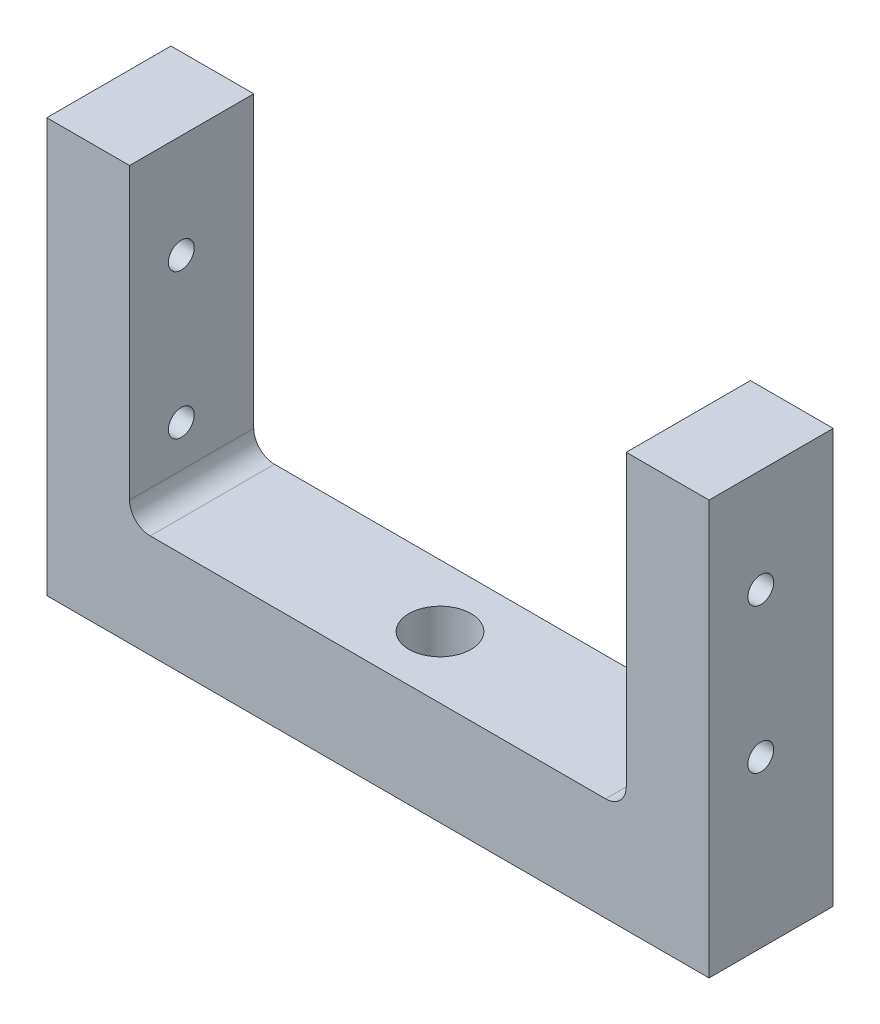
ISO-10303-21;
HEADER;
FILE_DESCRIPTION(('STEP AP214'),'2;1');
FILE_NAME('part.step','',(''),(''),'','','');
FILE_SCHEMA(('AUTOMOTIVE_DESIGN { 1 0 10303 214 1 1 1 1 }'));
ENDSEC;
DATA;
#1=APPLICATION_CONTEXT('core data for automotive mechanical design processes');
#2=APPLICATION_PROTOCOL_DEFINITION('international standard','automotive_design',2000,#1);
#3=PRODUCT_CONTEXT('',#1,'mechanical');
#4=PRODUCT('Part','Part','',(#3));
#5=PRODUCT_RELATED_PRODUCT_CATEGORY('part','',(#4));
#6=PRODUCT_DEFINITION_FORMATION('','',#4);
#7=PRODUCT_DEFINITION_CONTEXT('part definition',#1,'design');
#8=PRODUCT_DEFINITION('design','',#6,#7);
#9=PRODUCT_DEFINITION_SHAPE('','',#8);
#10=(LENGTH_UNIT() NAMED_UNIT(*) SI_UNIT(.MILLI.,.METRE.));
#11=(NAMED_UNIT(*) PLANE_ANGLE_UNIT() SI_UNIT($,.RADIAN.));
#12=(NAMED_UNIT(*) SI_UNIT($,.STERADIAN.) SOLID_ANGLE_UNIT());
#13=UNCERTAINTY_MEASURE_WITH_UNIT(LENGTH_MEASURE(1.E-05),#10,'distance_accuracy_value','');
#14=(GEOMETRIC_REPRESENTATION_CONTEXT(3) GLOBAL_UNCERTAINTY_ASSIGNED_CONTEXT((#13)) GLOBAL_UNIT_ASSIGNED_CONTEXT((#10,
#11,#12)) REPRESENTATION_CONTEXT('',''));
#15=CARTESIAN_POINT('',(0.,0.,0.));
#16=DIRECTION('',(0.,0.,1.));
#17=DIRECTION('',(1.,0.,0.));
#18=AXIS2_PLACEMENT_3D('',#15,#16,#17);
#19=CARTESIAN_POINT('',(0.,10.,6.));
#20=DIRECTION('',(0.,1.,0.));
#21=DIRECTION('',(0.,0.,1.));
#22=AXIS2_PLACEMENT_3D('',#19,#20,#21);
#23=PLANE('',#22);
#24=DIRECTION('',(1.,0.,0.));
#25=VECTOR('',#24,1.);
#26=CARTESIAN_POINT('',(0.,10.,0.));
#27=LINE('',#26,#25);
#28=CARTESIAN_POINT('',(12.,10.,0.));
#29=VERTEX_POINT('',#28);
#30=CARTESIAN_POINT('',(16.,10.,0.));
#31=VERTEX_POINT('',#30);
#32=EDGE_CURVE('E125',#29,#31,#27,.T.);
#33=ORIENTED_EDGE('',*,*,#32,.F.);
#34=DIRECTION('',(0.,0.,-1.));
#35=VECTOR('',#34,1.);
#36=CARTESIAN_POINT('',(12.,10.,6.));
#37=LINE('',#36,#35);
#38=CARTESIAN_POINT('',(12.,10.,6.));
#39=VERTEX_POINT('',#38);
#40=EDGE_CURVE('E120',#39,#29,#37,.T.);
#41=ORIENTED_EDGE('',*,*,#40,.F.);
#42=DIRECTION('',(1.,0.,0.));
#43=VECTOR('',#42,1.);
#44=CARTESIAN_POINT('',(0.,10.,6.));
#45=LINE('',#44,#43);
#46=CARTESIAN_POINT('',(16.,10.,6.));
#47=VERTEX_POINT('',#46);
#48=EDGE_CURVE('E122',#39,#47,#45,.T.);
#49=ORIENTED_EDGE('',*,*,#48,.T.);
#50=DIRECTION('',(0.,0.,-1.));
#51=VECTOR('',#50,1.);
#52=CARTESIAN_POINT('',(16.,10.,6.));
#53=LINE('',#52,#51);
#54=EDGE_CURVE('E173',#47,#31,#53,.T.);
#55=ORIENTED_EDGE('',*,*,#54,.T.);
#56=EDGE_LOOP('',(#33,#41,#49,#55));
#57=FACE_BOUND('',#56,.T.);
#58=ADVANCED_FACE('F42',(#57),#23,.T.);
#59=CARTESIAN_POINT('',(12.,0.,6.));
#60=DIRECTION('',(1.,0.,0.));
#61=DIRECTION('',(0.,1.,0.));
#62=AXIS2_PLACEMENT_3D('',#59,#60,#61);
#63=PLANE('',#62);
#64=CARTESIAN_POINT('',(12.,5.,3.5));
#65=DIRECTION('',(1.,0.,0.));
#66=DIRECTION('',(0.,1.,0.));
#67=AXIS2_PLACEMENT_3D('',#64,#65,#66);
#68=CIRCLE('',#67,0.625);
#69=CARTESIAN_POINT('',(12.,5.625,3.5));
#70=VERTEX_POINT('',#69);
#71=EDGE_CURVE('E250',#70,#70,#68,.T.);
#72=ORIENTED_EDGE('',*,*,#71,.T.);
#73=EDGE_LOOP('',(#72));
#74=FACE_BOUND('',#73,.T.);
#75=CARTESIAN_POINT('',(12.,-2.,3.5));
#76=DIRECTION('',(1.,0.,0.));
#77=DIRECTION('',(0.,1.,0.));
#78=AXIS2_PLACEMENT_3D('',#75,#76,#77);
#79=CIRCLE('',#78,0.625);
#80=CARTESIAN_POINT('',(12.,-1.375,3.5));
#81=VERTEX_POINT('',#80);
#82=EDGE_CURVE('E257',#81,#81,#79,.T.);
#83=ORIENTED_EDGE('',*,*,#82,.T.);
#84=EDGE_LOOP('',(#83));
#85=FACE_BOUND('',#84,.T.);
#86=DIRECTION('',(0.,-1.,0.));
#87=VECTOR('',#86,1.);
#88=CARTESIAN_POINT('',(12.,0.,0.));
#89=LINE('',#88,#87);
#90=CARTESIAN_POINT('',(12.,-4.,0.));
#91=VERTEX_POINT('',#90);
#92=EDGE_CURVE('E176',#29,#91,#89,.T.);
#93=ORIENTED_EDGE('',*,*,#92,.T.);
#94=DIRECTION('',(0.,0.,-1.));
#95=VECTOR('',#94,1.);
#96=CARTESIAN_POINT('',(12.,-4.,6.));
#97=LINE('',#96,#95);
#98=CARTESIAN_POINT('',(12.,-4.,6.));
#99=VERTEX_POINT('',#98);
#100=EDGE_CURVE('E58',#91,#99,#97,.F.);
#101=ORIENTED_EDGE('',*,*,#100,.T.);
#102=DIRECTION('',(0.,-1.,0.));
#103=VECTOR('',#102,1.);
#104=CARTESIAN_POINT('',(12.,0.,6.));
#105=LINE('',#104,#103);
#106=EDGE_CURVE('E130',#39,#99,#105,.T.);
#107=ORIENTED_EDGE('',*,*,#106,.F.);
#108=ORIENTED_EDGE('',*,*,#40,.T.);
#109=EDGE_LOOP('',(#93,#101,#107,#108));
#110=FACE_BOUND('',#109,.T.);
#111=ADVANCED_FACE('F131',(#74,#85,#110),#63,.F.);
#112=CARTESIAN_POINT('',(0.,-5.,6.));
#113=DIRECTION('',(0.,1.,0.));
#114=DIRECTION('',(0.,0.,1.));
#115=AXIS2_PLACEMENT_3D('',#112,#113,#114);
#116=PLANE('',#115);
#117=CARTESIAN_POINT('',(0.,-5.,3.));
#118=DIRECTION('',(0.,1.,0.));
#119=DIRECTION('',(0.,0.,1.));
#120=AXIS2_PLACEMENT_3D('',#117,#118,#119);
#121=CIRCLE('',#120,1.5);
#122=CARTESIAN_POINT('',(0.,-5.,4.5));
#123=VERTEX_POINT('',#122);
#124=EDGE_CURVE('E246',#123,#123,#121,.T.);
#125=ORIENTED_EDGE('',*,*,#124,.F.);
#126=EDGE_LOOP('',(#125));
#127=FACE_BOUND('',#126,.T.);
#128=DIRECTION('',(1.,0.,0.));
#129=VECTOR('',#128,1.);
#130=CARTESIAN_POINT('',(0.,-5.,6.));
#131=LINE('',#130,#129);
#132=CARTESIAN_POINT('',(-11.,-5.,6.));
#133=VERTEX_POINT('',#132);
#134=CARTESIAN_POINT('',(11.,-5.,6.));
#135=VERTEX_POINT('',#134);
#136=EDGE_CURVE('E135',#133,#135,#131,.T.);
#137=ORIENTED_EDGE('',*,*,#136,.T.);
#138=DIRECTION('',(0.,0.,-1.));
#139=VECTOR('',#138,1.);
#140=CARTESIAN_POINT('',(11.,-5.,6.));
#141=LINE('',#140,#139);
#142=CARTESIAN_POINT('',(11.,-5.,0.));
#143=VERTEX_POINT('',#142);
#144=EDGE_CURVE('E219',#135,#143,#141,.T.);
#145=ORIENTED_EDGE('',*,*,#144,.T.);
#146=DIRECTION('',(1.,0.,0.));
#147=VECTOR('',#146,1.);
#148=CARTESIAN_POINT('',(0.,-5.,0.));
#149=LINE('',#148,#147);
#150=CARTESIAN_POINT('',(-11.,-5.,0.));
#151=VERTEX_POINT('',#150);
#152=EDGE_CURVE('E181',#151,#143,#149,.T.);
#153=ORIENTED_EDGE('',*,*,#152,.F.);
#154=DIRECTION('',(0.,0.,-1.));
#155=VECTOR('',#154,1.);
#156=CARTESIAN_POINT('',(-11.,-5.,6.));
#157=LINE('',#156,#155);
#158=EDGE_CURVE('E210',#151,#133,#157,.F.);
#159=ORIENTED_EDGE('',*,*,#158,.T.);
#160=EDGE_LOOP('',(#137,#145,#153,#159));
#161=FACE_BOUND('',#160,.T.);
#162=ADVANCED_FACE('F228',(#127,#161),#116,.T.);
#163=CARTESIAN_POINT('',(-12.,0.,6.));
#164=DIRECTION('',(1.,0.,0.));
#165=DIRECTION('',(0.,1.,0.));
#166=AXIS2_PLACEMENT_3D('',#163,#164,#165);
#167=PLANE('',#166);
#168=CARTESIAN_POINT('',(-12.,5.,3.5));
#169=DIRECTION('',(1.,0.,0.));
#170=DIRECTION('',(0.,1.,0.));
#171=AXIS2_PLACEMENT_3D('',#168,#169,#170);
#172=CIRCLE('',#171,0.625);
#173=CARTESIAN_POINT('',(-12.,5.625,3.5));
#174=VERTEX_POINT('',#173);
#175=EDGE_CURVE('E253',#174,#174,#172,.T.);
#176=ORIENTED_EDGE('',*,*,#175,.F.);
#177=EDGE_LOOP('',(#176));
#178=FACE_BOUND('',#177,.T.);
#179=CARTESIAN_POINT('',(-12.,-2.,3.5));
#180=DIRECTION('',(1.,0.,0.));
#181=DIRECTION('',(0.,1.,0.));
#182=AXIS2_PLACEMENT_3D('',#179,#180,#181);
#183=CIRCLE('',#182,0.625);
#184=CARTESIAN_POINT('',(-12.,-1.375,3.5));
#185=VERTEX_POINT('',#184);
#186=EDGE_CURVE('E261',#185,#185,#183,.T.);
#187=ORIENTED_EDGE('',*,*,#186,.F.);
#188=EDGE_LOOP('',(#187));
#189=FACE_BOUND('',#188,.T.);
#190=DIRECTION('',(0.,-1.,0.));
#191=VECTOR('',#190,1.);
#192=CARTESIAN_POINT('',(-12.,0.,6.));
#193=LINE('',#192,#191);
#194=CARTESIAN_POINT('',(-12.,10.,6.));
#195=VERTEX_POINT('',#194);
#196=CARTESIAN_POINT('',(-12.,-4.,6.));
#197=VERTEX_POINT('',#196);
#198=EDGE_CURVE('E152',#195,#197,#193,.T.);
#199=ORIENTED_EDGE('',*,*,#198,.T.);
#200=DIRECTION('',(0.,0.,-1.));
#201=VECTOR('',#200,1.);
#202=CARTESIAN_POINT('',(-12.,-4.,0.));
#203=LINE('',#202,#201);
#204=CARTESIAN_POINT('',(-12.,-4.,0.));
#205=VERTEX_POINT('',#204);
#206=EDGE_CURVE('E127',#197,#205,#203,.T.);
#207=ORIENTED_EDGE('',*,*,#206,.T.);
#208=DIRECTION('',(0.,-1.,0.));
#209=VECTOR('',#208,1.);
#210=CARTESIAN_POINT('',(-12.,0.,0.));
#211=LINE('',#210,#209);
#212=CARTESIAN_POINT('',(-12.,10.,0.));
#213=VERTEX_POINT('',#212);
#214=EDGE_CURVE('E184',#213,#205,#211,.T.);
#215=ORIENTED_EDGE('',*,*,#214,.F.);
#216=DIRECTION('',(0.,0.,-1.));
#217=VECTOR('',#216,1.);
#218=CARTESIAN_POINT('',(-12.,10.,6.));
#219=LINE('',#218,#217);
#220=EDGE_CURVE('E128',#195,#213,#219,.T.);
#221=ORIENTED_EDGE('',*,*,#220,.F.);
#222=EDGE_LOOP('',(#199,#207,#215,#221));
#223=FACE_BOUND('',#222,.T.);
#224=ADVANCED_FACE('F238',(#178,#189,#223),#167,.T.);
#225=CARTESIAN_POINT('',(-16.,10.,0.));
#226=VERTEX_POINT('',#225);
#227=EDGE_CURVE('E178',#226,#213,#27,.T.);
#228=ORIENTED_EDGE('',*,*,#227,.F.);
#229=DIRECTION('',(0.,0.,-1.));
#230=VECTOR('',#229,1.);
#231=CARTESIAN_POINT('',(-16.,10.,6.));
#232=LINE('',#231,#230);
#233=CARTESIAN_POINT('',(-16.,10.,6.));
#234=VERTEX_POINT('',#233);
#235=EDGE_CURVE('E203',#234,#226,#232,.T.);
#236=ORIENTED_EDGE('',*,*,#235,.F.);
#237=EDGE_CURVE('E143',#234,#195,#45,.T.);
#238=ORIENTED_EDGE('',*,*,#237,.T.);
#239=ORIENTED_EDGE('',*,*,#220,.T.);
#240=EDGE_LOOP('',(#228,#236,#238,#239));
#241=FACE_BOUND('',#240,.T.);
#242=ADVANCED_FACE('F306',(#241),#23,.T.);
#243=CARTESIAN_POINT('',(-16.,0.,6.));
#244=DIRECTION('',(1.,0.,0.));
#245=DIRECTION('',(0.,1.,0.));
#246=AXIS2_PLACEMENT_3D('',#243,#244,#245);
#247=PLANE('',#246);
#248=CARTESIAN_POINT('',(-16.,5.,3.5));
#249=DIRECTION('',(1.,0.,0.));
#250=DIRECTION('',(0.,0.,-1.));
#251=AXIS2_PLACEMENT_3D('',#248,#249,#250);
#252=CIRCLE('',#251,0.625);
#253=CARTESIAN_POINT('',(-16.,5.,2.875));
#254=VERTEX_POINT('',#253);
#255=EDGE_CURVE('E265',#254,#254,#252,.T.);
#256=ORIENTED_EDGE('',*,*,#255,.T.);
#257=EDGE_LOOP('',(#256));
#258=FACE_BOUND('',#257,.T.);
#259=CARTESIAN_POINT('',(-16.,-2.,3.5));
#260=DIRECTION('',(1.,0.,0.));
#261=DIRECTION('',(0.,0.,-1.));
#262=AXIS2_PLACEMENT_3D('',#259,#260,#261);
#263=CIRCLE('',#262,0.625);
#264=CARTESIAN_POINT('',(-16.,-2.,2.875));
#265=VERTEX_POINT('',#264);
#266=EDGE_CURVE('E273',#265,#265,#263,.T.);
#267=ORIENTED_EDGE('',*,*,#266,.T.);
#268=EDGE_LOOP('',(#267));
#269=FACE_BOUND('',#268,.T.);
#270=DIRECTION('',(0.,-1.,0.));
#271=VECTOR('',#270,1.);
#272=CARTESIAN_POINT('',(-16.,0.,0.));
#273=LINE('',#272,#271);
#274=CARTESIAN_POINT('',(-16.,-10.,0.));
#275=VERTEX_POINT('',#274);
#276=EDGE_CURVE('E188',#226,#275,#273,.T.);
#277=ORIENTED_EDGE('',*,*,#276,.T.);
#278=DIRECTION('',(0.,0.,-1.));
#279=VECTOR('',#278,1.);
#280=CARTESIAN_POINT('',(-16.,-10.,6.));
#281=LINE('',#280,#279);
#282=CARTESIAN_POINT('',(-16.,-10.,6.));
#283=VERTEX_POINT('',#282);
#284=EDGE_CURVE('E199',#283,#275,#281,.T.);
#285=ORIENTED_EDGE('',*,*,#284,.F.);
#286=DIRECTION('',(0.,-1.,0.));
#287=VECTOR('',#286,1.);
#288=CARTESIAN_POINT('',(-16.,0.,6.));
#289=LINE('',#288,#287);
#290=EDGE_CURVE('E151',#234,#283,#289,.T.);
#291=ORIENTED_EDGE('',*,*,#290,.F.);
#292=ORIENTED_EDGE('',*,*,#235,.T.);
#293=EDGE_LOOP('',(#277,#285,#291,#292));
#294=FACE_BOUND('',#293,.T.);
#295=ADVANCED_FACE('F298',(#258,#269,#294),#247,.F.);
#296=CARTESIAN_POINT('',(0.,-10.,6.));
#297=DIRECTION('',(0.,1.,0.));
#298=DIRECTION('',(0.,0.,1.));
#299=AXIS2_PLACEMENT_3D('',#296,#297,#298);
#300=PLANE('',#299);
#301=CARTESIAN_POINT('',(0.,-10.,3.));
#302=DIRECTION('',(0.,1.,0.));
#303=DIRECTION('',(0.,0.,1.));
#304=AXIS2_PLACEMENT_3D('',#301,#302,#303);
#305=CIRCLE('',#304,1.5);
#306=CARTESIAN_POINT('',(0.,-10.,4.5));
#307=VERTEX_POINT('',#306);
#308=EDGE_CURVE('E177',#307,#307,#305,.T.);
#309=ORIENTED_EDGE('',*,*,#308,.T.);
#310=EDGE_LOOP('',(#309));
#311=FACE_BOUND('',#310,.T.);
#312=DIRECTION('',(1.,0.,0.));
#313=VECTOR('',#312,1.);
#314=CARTESIAN_POINT('',(0.,-10.,0.));
#315=LINE('',#314,#313);
#316=CARTESIAN_POINT('',(16.,-10.,0.));
#317=VERTEX_POINT('',#316);
#318=EDGE_CURVE('E146',#275,#317,#315,.T.);
#319=ORIENTED_EDGE('',*,*,#318,.T.);
#320=DIRECTION('',(0.,0.,-1.));
#321=VECTOR('',#320,1.);
#322=CARTESIAN_POINT('',(16.,-10.,6.));
#323=LINE('',#322,#321);
#324=CARTESIAN_POINT('',(16.,-10.,6.));
#325=VERTEX_POINT('',#324);
#326=EDGE_CURVE('E196',#325,#317,#323,.T.);
#327=ORIENTED_EDGE('',*,*,#326,.F.);
#328=DIRECTION('',(1.,0.,0.));
#329=VECTOR('',#328,1.);
#330=CARTESIAN_POINT('',(0.,-10.,6.));
#331=LINE('',#330,#329);
#332=EDGE_CURVE('E157',#283,#325,#331,.T.);
#333=ORIENTED_EDGE('',*,*,#332,.F.);
#334=ORIENTED_EDGE('',*,*,#284,.T.);
#335=EDGE_LOOP('',(#319,#327,#333,#334));
#336=FACE_BOUND('',#335,.T.);
#337=ADVANCED_FACE('F289',(#311,#336),#300,.F.);
#338=CARTESIAN_POINT('',(16.,0.,6.));
#339=DIRECTION('',(1.,0.,0.));
#340=DIRECTION('',(0.,0.,-1.));
#341=AXIS2_PLACEMENT_3D('',#338,#339,#340);
#342=PLANE('',#341);
#343=CARTESIAN_POINT('',(16.,5.,3.5));
#344=DIRECTION('',(1.,0.,0.));
#345=DIRECTION('',(0.,0.,-1.));
#346=AXIS2_PLACEMENT_3D('',#343,#344,#345);
#347=CIRCLE('',#346,0.625);
#348=CARTESIAN_POINT('',(16.,5.,2.875));
#349=VERTEX_POINT('',#348);
#350=EDGE_CURVE('E269',#349,#349,#347,.T.);
#351=ORIENTED_EDGE('',*,*,#350,.F.);
#352=EDGE_LOOP('',(#351));
#353=FACE_BOUND('',#352,.T.);
#354=CARTESIAN_POINT('',(16.,-2.,3.5));
#355=DIRECTION('',(1.,0.,0.));
#356=DIRECTION('',(0.,0.,-1.));
#357=AXIS2_PLACEMENT_3D('',#354,#355,#356);
#358=CIRCLE('',#357,0.625);
#359=CARTESIAN_POINT('',(16.,-2.,2.875));
#360=VERTEX_POINT('',#359);
#361=EDGE_CURVE('E277',#360,#360,#358,.T.);
#362=ORIENTED_EDGE('',*,*,#361,.F.);
#363=EDGE_LOOP('',(#362));
#364=FACE_BOUND('',#363,.T.);
#365=DIRECTION('',(0.,-1.,0.));
#366=VECTOR('',#365,1.);
#367=CARTESIAN_POINT('',(16.,0.,0.));
#368=LINE('',#367,#366);
#369=EDGE_CURVE('E141',#31,#317,#368,.T.);
#370=ORIENTED_EDGE('',*,*,#369,.F.);
#371=ORIENTED_EDGE('',*,*,#54,.F.);
#372=DIRECTION('',(0.,-1.,0.));
#373=VECTOR('',#372,1.);
#374=CARTESIAN_POINT('',(16.,0.,6.));
#375=LINE('',#374,#373);
#376=EDGE_CURVE('E139',#47,#325,#375,.T.);
#377=ORIENTED_EDGE('',*,*,#376,.T.);
#378=ORIENTED_EDGE('',*,*,#326,.T.);
#379=EDGE_LOOP('',(#370,#371,#377,#378));
#380=FACE_BOUND('',#379,.T.);
#381=ADVANCED_FACE('F286',(#353,#364,#380),#342,.T.);
#382=CARTESIAN_POINT('',(0.,0.,6.));
#383=DIRECTION('',(0.,0.,1.));
#384=DIRECTION('',(1.,0.,0.));
#385=AXIS2_PLACEMENT_3D('',#382,#383,#384);
#386=PLANE('',#385);
#387=ORIENTED_EDGE('',*,*,#48,.F.);
#388=ORIENTED_EDGE('',*,*,#106,.T.);
#389=CARTESIAN_POINT('',(11.,-4.,6.));
#390=DIRECTION('',(0.,0.,1.));
#391=DIRECTION('',(1.,0.,0.));
#392=AXIS2_PLACEMENT_3D('',#389,#390,#391);
#393=CIRCLE('',#392,1.);
#394=EDGE_CURVE('E12',#99,#135,#393,.F.);
#395=ORIENTED_EDGE('',*,*,#394,.T.);
#396=ORIENTED_EDGE('',*,*,#136,.F.);
#397=CARTESIAN_POINT('',(-11.,-4.,6.));
#398=DIRECTION('',(0.,0.,1.));
#399=DIRECTION('',(1.,0.,0.));
#400=AXIS2_PLACEMENT_3D('',#397,#398,#399);
#401=CIRCLE('',#400,1.);
#402=EDGE_CURVE('E216',#133,#197,#401,.F.);
#403=ORIENTED_EDGE('',*,*,#402,.T.);
#404=ORIENTED_EDGE('',*,*,#198,.F.);
#405=ORIENTED_EDGE('',*,*,#237,.F.);
#406=ORIENTED_EDGE('',*,*,#290,.T.);
#407=ORIENTED_EDGE('',*,*,#332,.T.);
#408=ORIENTED_EDGE('',*,*,#376,.F.);
#409=EDGE_LOOP('',(#387,#388,#395,#396,#403,#404,#405,#406,#407,#408));
#410=FACE_BOUND('',#409,.T.);
#411=ADVANCED_FACE('F137',(#410),#386,.T.);
#412=CARTESIAN_POINT('',(0.,0.,0.));
#413=DIRECTION('',(0.,0.,1.));
#414=DIRECTION('',(1.,0.,0.));
#415=AXIS2_PLACEMENT_3D('',#412,#413,#414);
#416=PLANE('',#415);
#417=ORIENTED_EDGE('',*,*,#32,.T.);
#418=ORIENTED_EDGE('',*,*,#369,.T.);
#419=ORIENTED_EDGE('',*,*,#318,.F.);
#420=ORIENTED_EDGE('',*,*,#276,.F.);
#421=ORIENTED_EDGE('',*,*,#227,.T.);
#422=ORIENTED_EDGE('',*,*,#214,.T.);
#423=CARTESIAN_POINT('',(-11.,-4.,0.));
#424=DIRECTION('',(0.,0.,1.));
#425=DIRECTION('',(1.,0.,0.));
#426=AXIS2_PLACEMENT_3D('',#423,#424,#425);
#427=CIRCLE('',#426,1.);
#428=EDGE_CURVE('E213',#205,#151,#427,.T.);
#429=ORIENTED_EDGE('',*,*,#428,.T.);
#430=ORIENTED_EDGE('',*,*,#152,.T.);
#431=CARTESIAN_POINT('',(11.,-4.,0.));
#432=DIRECTION('',(0.,0.,1.));
#433=DIRECTION('',(1.,0.,0.));
#434=AXIS2_PLACEMENT_3D('',#431,#432,#433);
#435=CIRCLE('',#434,1.);
#436=EDGE_CURVE('E51',#143,#91,#435,.T.);
#437=ORIENTED_EDGE('',*,*,#436,.T.);
#438=ORIENTED_EDGE('',*,*,#92,.F.);
#439=EDGE_LOOP('',(#417,#418,#419,#420,#421,#422,#429,#430,#437,#438));
#440=FACE_BOUND('',#439,.T.);
#441=ADVANCED_FACE('F232',(#440),#416,.F.);
#442=CARTESIAN_POINT('',(0.,-10.,3.));
#443=DIRECTION('',(0.,1.,0.));
#444=DIRECTION('',(0.,0.,1.));
#445=AXIS2_PLACEMENT_3D('',#442,#443,#444);
#446=CYLINDRICAL_SURFACE('',#445,1.5);
#447=ORIENTED_EDGE('',*,*,#308,.F.);
#448=EDGE_LOOP('',(#447));
#449=FACE_BOUND('',#448,.T.);
#450=ORIENTED_EDGE('',*,*,#124,.T.);
#451=EDGE_LOOP('',(#450));
#452=FACE_BOUND('',#451,.T.);
#453=ADVANCED_FACE('F350',(#449,#452),#446,.F.);
#454=CARTESIAN_POINT('',(-16.,-2.,3.5));
#455=DIRECTION('',(1.,0.,0.));
#456=DIRECTION('',(0.,0.,-1.));
#457=AXIS2_PLACEMENT_3D('',#454,#455,#456);
#458=CYLINDRICAL_SURFACE('',#457,0.625);
#459=ORIENTED_EDGE('',*,*,#361,.T.);
#460=EDGE_LOOP('',(#459));
#461=FACE_BOUND('',#460,.T.);
#462=ORIENTED_EDGE('',*,*,#82,.F.);
#463=EDGE_LOOP('',(#462));
#464=FACE_BOUND('',#463,.T.);
#465=ADVANCED_FACE('F283',(#461,#464),#458,.F.);
#466=CARTESIAN_POINT('',(-16.,5.,3.5));
#467=DIRECTION('',(1.,0.,0.));
#468=DIRECTION('',(0.,0.,-1.));
#469=AXIS2_PLACEMENT_3D('',#466,#467,#468);
#470=CYLINDRICAL_SURFACE('',#469,0.625);
#471=ORIENTED_EDGE('',*,*,#350,.T.);
#472=EDGE_LOOP('',(#471));
#473=FACE_BOUND('',#472,.T.);
#474=ORIENTED_EDGE('',*,*,#71,.F.);
#475=EDGE_LOOP('',(#474));
#476=FACE_BOUND('',#475,.T.);
#477=ADVANCED_FACE('F338',(#473,#476),#470,.F.);
#478=ORIENTED_EDGE('',*,*,#186,.T.);
#479=EDGE_LOOP('',(#478));
#480=FACE_BOUND('',#479,.T.);
#481=ORIENTED_EDGE('',*,*,#266,.F.);
#482=EDGE_LOOP('',(#481));
#483=FACE_BOUND('',#482,.T.);
#484=ADVANCED_FACE('F335',(#480,#483),#458,.F.);
#485=ORIENTED_EDGE('',*,*,#175,.T.);
#486=EDGE_LOOP('',(#485));
#487=FACE_BOUND('',#486,.T.);
#488=ORIENTED_EDGE('',*,*,#255,.F.);
#489=EDGE_LOOP('',(#488));
#490=FACE_BOUND('',#489,.T.);
#491=ADVANCED_FACE('F330',(#487,#490),#470,.F.);
#492=CARTESIAN_POINT('',(-11.,-4.,6.));
#493=DIRECTION('',(0.,0.,1.));
#494=DIRECTION('',(1.,0.,0.));
#495=AXIS2_PLACEMENT_3D('',#492,#493,#494);
#496=CYLINDRICAL_SURFACE('',#495,1.);
#497=ORIENTED_EDGE('',*,*,#402,.F.);
#498=ORIENTED_EDGE('',*,*,#158,.F.);
#499=ORIENTED_EDGE('',*,*,#428,.F.);
#500=ORIENTED_EDGE('',*,*,#206,.F.);
#501=EDGE_LOOP('',(#497,#498,#499,#500));
#502=FACE_BOUND('',#501,.T.);
#503=ADVANCED_FACE('F237',(#502),#496,.F.);
#504=CARTESIAN_POINT('',(11.,-4.,6.));
#505=DIRECTION('',(0.,0.,-1.));
#506=DIRECTION('',(-1.,0.,0.));
#507=AXIS2_PLACEMENT_3D('',#504,#505,#506);
#508=CYLINDRICAL_SURFACE('',#507,1.);
#509=ORIENTED_EDGE('',*,*,#394,.F.);
#510=ORIENTED_EDGE('',*,*,#100,.F.);
#511=ORIENTED_EDGE('',*,*,#436,.F.);
#512=ORIENTED_EDGE('',*,*,#144,.F.);
#513=EDGE_LOOP('',(#509,#510,#511,#512));
#514=FACE_BOUND('',#513,.T.);
#515=ADVANCED_FACE('F44',(#514),#508,.F.);
#516=CLOSED_SHELL('',(#58,#111,#162,#224,#242,#295,#337,#381,#411,#441,#453,#465,#477,#484,#491,
#503,#515));
#517=MANIFOLD_SOLID_BREP('B2',#516);
#518=ADVANCED_BREP_SHAPE_REPRESENTATION('',(#18,#517),#14);
#519=SHAPE_DEFINITION_REPRESENTATION(#9,#518);
ENDSEC;
END-ISO-10303-21;
